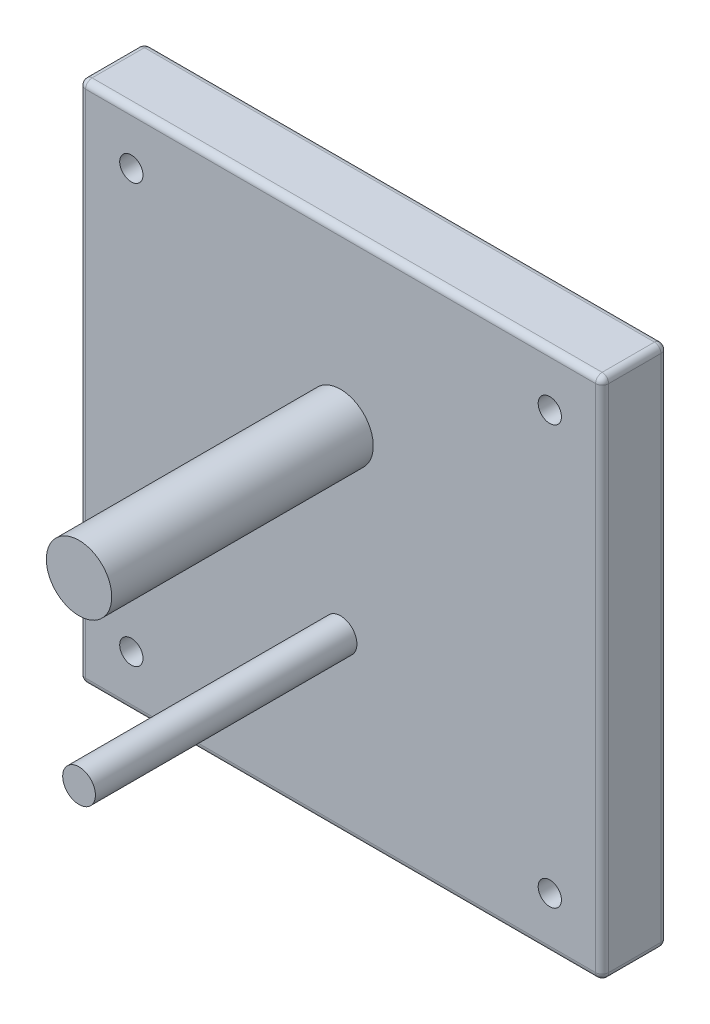
ISO-10303-21;
HEADER;
FILE_DESCRIPTION(('STEP AP214'),'2;1');
FILE_NAME('part.step','',(''),(''),'','','');
FILE_SCHEMA(('AUTOMOTIVE_DESIGN { 1 0 10303 214 1 1 1 1 }'));
ENDSEC;
DATA;
#1=APPLICATION_CONTEXT('core data for automotive mechanical design processes');
#2=APPLICATION_PROTOCOL_DEFINITION('international standard','automotive_design',2000,#1);
#3=PRODUCT_CONTEXT('',#1,'mechanical');
#4=PRODUCT('Part','Part','',(#3));
#5=PRODUCT_RELATED_PRODUCT_CATEGORY('part','',(#4));
#6=PRODUCT_DEFINITION_FORMATION('','',#4);
#7=PRODUCT_DEFINITION_CONTEXT('part definition',#1,'design');
#8=PRODUCT_DEFINITION('design','',#6,#7);
#9=PRODUCT_DEFINITION_SHAPE('','',#8);
#10=(LENGTH_UNIT() NAMED_UNIT(*) SI_UNIT(.MILLI.,.METRE.));
#11=(NAMED_UNIT(*) PLANE_ANGLE_UNIT() SI_UNIT($,.RADIAN.));
#12=(NAMED_UNIT(*) SI_UNIT($,.STERADIAN.) SOLID_ANGLE_UNIT());
#13=UNCERTAINTY_MEASURE_WITH_UNIT(LENGTH_MEASURE(1.E-05),#10,'distance_accuracy_value','');
#14=(GEOMETRIC_REPRESENTATION_CONTEXT(3) GLOBAL_UNCERTAINTY_ASSIGNED_CONTEXT((#13)) GLOBAL_UNIT_ASSIGNED_CONTEXT((#10,
#11,#12)) REPRESENTATION_CONTEXT('',''));
#15=CARTESIAN_POINT('',(0.,0.,0.));
#16=DIRECTION('',(0.,0.,1.));
#17=DIRECTION('',(1.,0.,0.));
#18=AXIS2_PLACEMENT_3D('',#15,#16,#17);
#19=CARTESIAN_POINT('',(25.4,25.4,6.35));
#20=DIRECTION('',(0.,-1.,0.));
#21=DIRECTION('',(0.,0.,-1.));
#22=AXIS2_PLACEMENT_3D('',#19,#20,#21);
#23=PLANE('',#22);
#24=DIRECTION('',(-1.,0.,0.));
#25=VECTOR('',#24,1.);
#26=CARTESIAN_POINT('',(25.4,25.4,5.715));
#27=LINE('',#26,#25);
#28=CARTESIAN_POINT('',(-24.765,25.4,5.715));
#29=VERTEX_POINT('',#28);
#30=CARTESIAN_POINT('',(24.765,25.4,5.715));
#31=VERTEX_POINT('',#30);
#32=EDGE_CURVE('E219',#29,#31,#27,.F.);
#33=ORIENTED_EDGE('',*,*,#32,.T.);
#34=DIRECTION('',(0.,0.,-1.));
#35=VECTOR('',#34,1.);
#36=CARTESIAN_POINT('',(24.765,25.4,6.35));
#37=LINE('',#36,#35);
#38=CARTESIAN_POINT('',(24.765,25.4,0.635));
#39=VERTEX_POINT('',#38);
#40=EDGE_CURVE('E222',#31,#39,#37,.T.);
#41=ORIENTED_EDGE('',*,*,#40,.T.);
#42=DIRECTION('',(-1.,0.,0.));
#43=VECTOR('',#42,1.);
#44=CARTESIAN_POINT('',(-25.4,25.4,0.635));
#45=LINE('',#44,#43);
#46=CARTESIAN_POINT('',(-24.765,25.4,0.635));
#47=VERTEX_POINT('',#46);
#48=EDGE_CURVE('E216',#39,#47,#45,.T.);
#49=ORIENTED_EDGE('',*,*,#48,.T.);
#50=DIRECTION('',(0.,0.,-1.));
#51=VECTOR('',#50,1.);
#52=CARTESIAN_POINT('',(-24.765,25.4,6.35));
#53=LINE('',#52,#51);
#54=EDGE_CURVE('E213',#47,#29,#53,.F.);
#55=ORIENTED_EDGE('',*,*,#54,.T.);
#56=EDGE_LOOP('',(#33,#41,#49,#55));
#57=FACE_BOUND('',#56,.T.);
#58=ADVANCED_FACE('F45',(#57),#23,.F.);
#59=CARTESIAN_POINT('',(-25.4,-25.4,6.35));
#60=DIRECTION('',(1.,0.,0.));
#61=DIRECTION('',(0.,0.,-1.));
#62=AXIS2_PLACEMENT_3D('',#59,#60,#61);
#63=PLANE('',#62);
#64=DIRECTION('',(0.,-1.,0.));
#65=VECTOR('',#64,1.);
#66=CARTESIAN_POINT('',(-25.4,-25.4,5.715));
#67=LINE('',#66,#65);
#68=CARTESIAN_POINT('',(-25.4,-24.765,5.715));
#69=VERTEX_POINT('',#68);
#70=CARTESIAN_POINT('',(-25.4,24.765,5.715));
#71=VERTEX_POINT('',#70);
#72=EDGE_CURVE('E153',#69,#71,#67,.F.);
#73=ORIENTED_EDGE('',*,*,#72,.T.);
#74=DIRECTION('',(0.,0.,-1.));
#75=VECTOR('',#74,1.);
#76=CARTESIAN_POINT('',(-25.4,24.765,6.35));
#77=LINE('',#76,#75);
#78=CARTESIAN_POINT('',(-25.4,24.765,0.635));
#79=VERTEX_POINT('',#78);
#80=EDGE_CURVE('E234',#71,#79,#77,.T.);
#81=ORIENTED_EDGE('',*,*,#80,.T.);
#82=DIRECTION('',(0.,-1.,0.));
#83=VECTOR('',#82,1.);
#84=CARTESIAN_POINT('',(-25.4,-25.4,0.635));
#85=LINE('',#84,#83);
#86=CARTESIAN_POINT('',(-25.4,-24.765,0.635));
#87=VERTEX_POINT('',#86);
#88=EDGE_CURVE('E229',#79,#87,#85,.T.);
#89=ORIENTED_EDGE('',*,*,#88,.T.);
#90=DIRECTION('',(0.,0.,-1.));
#91=VECTOR('',#90,1.);
#92=CARTESIAN_POINT('',(-25.4,-24.765,6.35));
#93=LINE('',#92,#91);
#94=EDGE_CURVE('E226',#87,#69,#93,.F.);
#95=ORIENTED_EDGE('',*,*,#94,.T.);
#96=EDGE_LOOP('',(#73,#81,#89,#95));
#97=FACE_BOUND('',#96,.T.);
#98=ADVANCED_FACE('F388',(#97),#63,.F.);
#99=CARTESIAN_POINT('',(25.4,-25.4,6.35));
#100=DIRECTION('',(0.,1.,0.));
#101=DIRECTION('',(0.,0.,1.));
#102=AXIS2_PLACEMENT_3D('',#99,#100,#101);
#103=PLANE('',#102);
#104=DIRECTION('',(1.,0.,0.));
#105=VECTOR('',#104,1.);
#106=CARTESIAN_POINT('',(25.4,-25.4,5.715));
#107=LINE('',#106,#105);
#108=CARTESIAN_POINT('',(24.765,-25.4,5.715));
#109=VERTEX_POINT('',#108);
#110=CARTESIAN_POINT('',(-24.765,-25.4,5.715));
#111=VERTEX_POINT('',#110);
#112=EDGE_CURVE('E55',#109,#111,#107,.F.);
#113=ORIENTED_EDGE('',*,*,#112,.T.);
#114=DIRECTION('',(0.,0.,-1.));
#115=VECTOR('',#114,1.);
#116=CARTESIAN_POINT('',(-24.765,-25.4,6.35));
#117=LINE('',#116,#115);
#118=CARTESIAN_POINT('',(-24.765,-25.4,0.635));
#119=VERTEX_POINT('',#118);
#120=EDGE_CURVE('E11',#111,#119,#117,.T.);
#121=ORIENTED_EDGE('',*,*,#120,.T.);
#122=DIRECTION('',(1.,0.,0.));
#123=VECTOR('',#122,1.);
#124=CARTESIAN_POINT('',(25.4,-25.4,0.635));
#125=LINE('',#124,#123);
#126=CARTESIAN_POINT('',(24.765,-25.4,0.635));
#127=VERTEX_POINT('',#126);
#128=EDGE_CURVE('E238',#119,#127,#125,.T.);
#129=ORIENTED_EDGE('',*,*,#128,.T.);
#130=DIRECTION('',(0.,0.,-1.));
#131=VECTOR('',#130,1.);
#132=CARTESIAN_POINT('',(24.765,-25.4,6.35));
#133=LINE('',#132,#131);
#134=EDGE_CURVE('E66',#127,#109,#133,.F.);
#135=ORIENTED_EDGE('',*,*,#134,.T.);
#136=EDGE_LOOP('',(#113,#121,#129,#135));
#137=FACE_BOUND('',#136,.T.);
#138=ADVANCED_FACE('F383',(#137),#103,.F.);
#139=CARTESIAN_POINT('',(25.4,-25.4,6.35));
#140=DIRECTION('',(-1.,0.,0.));
#141=DIRECTION('',(0.,0.,1.));
#142=AXIS2_PLACEMENT_3D('',#139,#140,#141);
#143=PLANE('',#142);
#144=DIRECTION('',(0.,1.,0.));
#145=VECTOR('',#144,1.);
#146=CARTESIAN_POINT('',(25.4,25.4,0.635));
#147=LINE('',#146,#145);
#148=CARTESIAN_POINT('',(25.4,-24.765,0.635));
#149=VERTEX_POINT('',#148);
#150=CARTESIAN_POINT('',(25.4,24.765,0.635));
#151=VERTEX_POINT('',#150);
#152=EDGE_CURVE('E190',#149,#151,#147,.T.);
#153=ORIENTED_EDGE('',*,*,#152,.T.);
#154=DIRECTION('',(0.,0.,-1.));
#155=VECTOR('',#154,1.);
#156=CARTESIAN_POINT('',(25.4,24.765,6.35));
#157=LINE('',#156,#155);
#158=CARTESIAN_POINT('',(25.4,24.765,5.715));
#159=VERTEX_POINT('',#158);
#160=EDGE_CURVE('E197',#151,#159,#157,.F.);
#161=ORIENTED_EDGE('',*,*,#160,.T.);
#162=DIRECTION('',(0.,1.,0.));
#163=VECTOR('',#162,1.);
#164=CARTESIAN_POINT('',(25.4,-25.4,5.715));
#165=LINE('',#164,#163);
#166=CARTESIAN_POINT('',(25.4,-24.765,5.715));
#167=VERTEX_POINT('',#166);
#168=EDGE_CURVE('E193',#159,#167,#165,.F.);
#169=ORIENTED_EDGE('',*,*,#168,.T.);
#170=DIRECTION('',(0.,0.,-1.));
#171=VECTOR('',#170,1.);
#172=CARTESIAN_POINT('',(25.4,-24.765,6.35));
#173=LINE('',#172,#171);
#174=EDGE_CURVE('E187',#167,#149,#173,.T.);
#175=ORIENTED_EDGE('',*,*,#174,.T.);
#176=EDGE_LOOP('',(#153,#161,#169,#175));
#177=FACE_BOUND('',#176,.T.);
#178=ADVANCED_FACE('F375',(#177),#143,.F.);
#179=CARTESIAN_POINT('',(0.,0.,6.35));
#180=DIRECTION('',(0.,0.,-1.));
#181=DIRECTION('',(-1.,0.,0.));
#182=AXIS2_PLACEMENT_3D('',#179,#180,#181);
#183=PLANE('',#182);
#184=DIRECTION('',(1.,0.,0.));
#185=VECTOR('',#184,1.);
#186=CARTESIAN_POINT('',(0.,-24.765,6.35));
#187=LINE('',#186,#185);
#188=CARTESIAN_POINT('',(-24.765,-24.765,6.35));
#189=VERTEX_POINT('',#188);
#190=CARTESIAN_POINT('',(24.765,-24.765,6.35));
#191=VERTEX_POINT('',#190);
#192=EDGE_CURVE('E139',#189,#191,#187,.T.);
#193=ORIENTED_EDGE('',*,*,#192,.T.);
#194=DIRECTION('',(0.,1.,0.));
#195=VECTOR('',#194,1.);
#196=CARTESIAN_POINT('',(24.765,0.,6.35));
#197=LINE('',#196,#195);
#198=CARTESIAN_POINT('',(24.765,24.765,6.35));
#199=VERTEX_POINT('',#198);
#200=EDGE_CURVE('E184',#191,#199,#197,.T.);
#201=ORIENTED_EDGE('',*,*,#200,.T.);
#202=DIRECTION('',(-1.,0.,0.));
#203=VECTOR('',#202,1.);
#204=CARTESIAN_POINT('',(0.,24.765,6.35));
#205=LINE('',#204,#203);
#206=CARTESIAN_POINT('',(-24.765,24.765,6.35));
#207=VERTEX_POINT('',#206);
#208=EDGE_CURVE('E142',#199,#207,#205,.T.);
#209=ORIENTED_EDGE('',*,*,#208,.T.);
#210=DIRECTION('',(0.,-1.,0.));
#211=VECTOR('',#210,1.);
#212=CARTESIAN_POINT('',(-24.765,0.,6.35));
#213=LINE('',#212,#211);
#214=EDGE_CURVE('E133',#207,#189,#213,.T.);
#215=ORIENTED_EDGE('',*,*,#214,.T.);
#216=EDGE_LOOP('',(#193,#201,#209,#215));
#217=FACE_BOUND('',#216,.T.);
#218=CARTESIAN_POINT('',(-20.32,20.32,6.35));
#219=DIRECTION('',(0.,0.,1.));
#220=DIRECTION('',(1.,0.,0.));
#221=AXIS2_PLACEMENT_3D('',#218,#219,#220);
#222=CIRCLE('',#221,1.1303);
#223=CARTESIAN_POINT('',(-19.1897,20.32,6.35));
#224=VERTEX_POINT('',#223);
#225=EDGE_CURVE('E321',#224,#224,#222,.T.);
#226=ORIENTED_EDGE('',*,*,#225,.F.);
#227=EDGE_LOOP('',(#226));
#228=FACE_BOUND('',#227,.T.);
#229=CARTESIAN_POINT('',(20.32,20.32,6.35));
#230=DIRECTION('',(0.,0.,1.));
#231=DIRECTION('',(1.,0.,0.));
#232=AXIS2_PLACEMENT_3D('',#229,#230,#231);
#233=CIRCLE('',#232,1.1303);
#234=CARTESIAN_POINT('',(21.4503,20.32,6.35));
#235=VERTEX_POINT('',#234);
#236=EDGE_CURVE('E334',#235,#235,#233,.T.);
#237=ORIENTED_EDGE('',*,*,#236,.F.);
#238=EDGE_LOOP('',(#237));
#239=FACE_BOUND('',#238,.T.);
#240=CARTESIAN_POINT('',(20.32,-20.32,6.35));
#241=DIRECTION('',(0.,0.,1.));
#242=DIRECTION('',(1.,0.,0.));
#243=AXIS2_PLACEMENT_3D('',#240,#241,#242);
#244=CIRCLE('',#243,1.1303);
#245=CARTESIAN_POINT('',(21.4503,-20.32,6.35));
#246=VERTEX_POINT('',#245);
#247=EDGE_CURVE('E344',#246,#246,#244,.T.);
#248=ORIENTED_EDGE('',*,*,#247,.F.);
#249=EDGE_LOOP('',(#248));
#250=FACE_BOUND('',#249,.T.);
#251=CARTESIAN_POINT('',(-20.32,-20.32,6.35));
#252=DIRECTION('',(0.,0.,1.));
#253=DIRECTION('',(1.,0.,0.));
#254=AXIS2_PLACEMENT_3D('',#251,#252,#253);
#255=CIRCLE('',#254,1.1303);
#256=CARTESIAN_POINT('',(-19.1897,-20.32,6.35));
#257=VERTEX_POINT('',#256);
#258=EDGE_CURVE('E352',#257,#257,#255,.T.);
#259=ORIENTED_EDGE('',*,*,#258,.F.);
#260=EDGE_LOOP('',(#259));
#261=FACE_BOUND('',#260,.T.);
#262=CARTESIAN_POINT('',(0.,-8.73125,6.35));
#263=DIRECTION('',(0.,0.,-1.));
#264=DIRECTION('',(-1.,0.,0.));
#265=AXIS2_PLACEMENT_3D('',#262,#263,#264);
#266=CIRCLE('',#265,1.5875);
#267=CARTESIAN_POINT('',(-1.5875,-8.73125,6.35));
#268=VERTEX_POINT('',#267);
#269=EDGE_CURVE('E174',#268,#268,#266,.F.);
#270=ORIENTED_EDGE('',*,*,#269,.F.);
#271=EDGE_LOOP('',(#270));
#272=FACE_BOUND('',#271,.T.);
#273=CARTESIAN_POINT('',(0.,8.73125,6.35));
#274=DIRECTION('',(0.,0.,-1.));
#275=DIRECTION('',(-1.,0.,0.));
#276=AXIS2_PLACEMENT_3D('',#273,#274,#275);
#277=CIRCLE('',#276,3.175);
#278=CARTESIAN_POINT('',(-3.175,8.73125,6.35));
#279=VERTEX_POINT('',#278);
#280=EDGE_CURVE('E178',#279,#279,#277,.F.);
#281=ORIENTED_EDGE('',*,*,#280,.F.);
#282=EDGE_LOOP('',(#281));
#283=FACE_BOUND('',#282,.T.);
#284=ADVANCED_FACE('F135',(#217,#228,#239,#250,#261,#272,#283),#183,.F.);
#285=CARTESIAN_POINT('',(0.,0.,0.));
#286=DIRECTION('',(0.,0.,-1.));
#287=DIRECTION('',(-1.,0.,0.));
#288=AXIS2_PLACEMENT_3D('',#285,#286,#287);
#289=PLANE('',#288);
#290=DIRECTION('',(-1.,0.,0.));
#291=VECTOR('',#290,1.);
#292=CARTESIAN_POINT('',(25.4,24.765,0.));
#293=LINE('',#292,#291);
#294=CARTESIAN_POINT('',(-24.765,24.765,0.));
#295=VERTEX_POINT('',#294);
#296=CARTESIAN_POINT('',(24.765,24.765,0.));
#297=VERTEX_POINT('',#296);
#298=EDGE_CURVE('E206',#295,#297,#293,.F.);
#299=ORIENTED_EDGE('',*,*,#298,.T.);
#300=DIRECTION('',(0.,1.,0.));
#301=VECTOR('',#300,1.);
#302=CARTESIAN_POINT('',(24.765,-25.4,0.));
#303=LINE('',#302,#301);
#304=CARTESIAN_POINT('',(24.765,-24.765,0.));
#305=VERTEX_POINT('',#304);
#306=EDGE_CURVE('E209',#297,#305,#303,.F.);
#307=ORIENTED_EDGE('',*,*,#306,.T.);
#308=DIRECTION('',(1.,0.,0.));
#309=VECTOR('',#308,1.);
#310=CARTESIAN_POINT('',(-25.4,-24.765,0.));
#311=LINE('',#310,#309);
#312=CARTESIAN_POINT('',(-24.765,-24.765,0.));
#313=VERTEX_POINT('',#312);
#314=EDGE_CURVE('E200',#305,#313,#311,.F.);
#315=ORIENTED_EDGE('',*,*,#314,.T.);
#316=DIRECTION('',(0.,-1.,0.));
#317=VECTOR('',#316,1.);
#318=CARTESIAN_POINT('',(-24.765,25.4,0.));
#319=LINE('',#318,#317);
#320=EDGE_CURVE('E203',#313,#295,#319,.F.);
#321=ORIENTED_EDGE('',*,*,#320,.T.);
#322=EDGE_LOOP('',(#299,#307,#315,#321));
#323=FACE_BOUND('',#322,.T.);
#324=CARTESIAN_POINT('',(-20.32,20.32,0.));
#325=DIRECTION('',(0.,0.,1.));
#326=DIRECTION('',(1.,0.,0.));
#327=AXIS2_PLACEMENT_3D('',#324,#325,#326);
#328=CIRCLE('',#327,1.1303);
#329=CARTESIAN_POINT('',(-19.1897,20.32,0.));
#330=VERTEX_POINT('',#329);
#331=EDGE_CURVE('E328',#330,#330,#328,.T.);
#332=ORIENTED_EDGE('',*,*,#331,.T.);
#333=EDGE_LOOP('',(#332));
#334=FACE_BOUND('',#333,.T.);
#335=CARTESIAN_POINT('',(20.32,20.32,0.));
#336=DIRECTION('',(0.,0.,1.));
#337=DIRECTION('',(1.,0.,0.));
#338=AXIS2_PLACEMENT_3D('',#335,#336,#337);
#339=CIRCLE('',#338,1.1303);
#340=CARTESIAN_POINT('',(21.4503,20.32,0.));
#341=VERTEX_POINT('',#340);
#342=EDGE_CURVE('E340',#341,#341,#339,.T.);
#343=ORIENTED_EDGE('',*,*,#342,.T.);
#344=EDGE_LOOP('',(#343));
#345=FACE_BOUND('',#344,.T.);
#346=CARTESIAN_POINT('',(20.32,-20.32,0.));
#347=DIRECTION('',(0.,0.,1.));
#348=DIRECTION('',(1.,0.,0.));
#349=AXIS2_PLACEMENT_3D('',#346,#347,#348);
#350=CIRCLE('',#349,1.1303);
#351=CARTESIAN_POINT('',(21.4503,-20.32,0.));
#352=VERTEX_POINT('',#351);
#353=EDGE_CURVE('E348',#352,#352,#350,.T.);
#354=ORIENTED_EDGE('',*,*,#353,.T.);
#355=EDGE_LOOP('',(#354));
#356=FACE_BOUND('',#355,.T.);
#357=CARTESIAN_POINT('',(-20.32,-20.32,0.));
#358=DIRECTION('',(0.,0.,1.));
#359=DIRECTION('',(1.,0.,0.));
#360=AXIS2_PLACEMENT_3D('',#357,#358,#359);
#361=CIRCLE('',#360,1.1303);
#362=CARTESIAN_POINT('',(-19.1897,-20.32,0.));
#363=VERTEX_POINT('',#362);
#364=EDGE_CURVE('E356',#363,#363,#361,.T.);
#365=ORIENTED_EDGE('',*,*,#364,.T.);
#366=EDGE_LOOP('',(#365));
#367=FACE_BOUND('',#366,.T.);
#368=ADVANCED_FACE('F374',(#323,#334,#345,#356,#367),#289,.T.);
#369=CARTESIAN_POINT('',(0.,8.73125,31.75));
#370=DIRECTION('',(0.,0.,-1.));
#371=DIRECTION('',(-1.,0.,0.));
#372=AXIS2_PLACEMENT_3D('',#369,#370,#371);
#373=CYLINDRICAL_SURFACE('',#372,3.175);
#374=CARTESIAN_POINT('',(0.,8.73125,31.75));
#375=DIRECTION('',(0.,0.,1.));
#376=DIRECTION('',(1.,0.,0.));
#377=AXIS2_PLACEMENT_3D('',#374,#375,#376);
#378=CIRCLE('',#377,3.175);
#379=CARTESIAN_POINT('',(3.175,8.73125,31.75));
#380=VERTEX_POINT('',#379);
#381=EDGE_CURVE('E360',#380,#380,#378,.T.);
#382=ORIENTED_EDGE('',*,*,#381,.F.);
#383=EDGE_LOOP('',(#382));
#384=FACE_BOUND('',#383,.T.);
#385=ORIENTED_EDGE('',*,*,#280,.T.);
#386=EDGE_LOOP('',(#385));
#387=FACE_BOUND('',#386,.T.);
#388=ADVANCED_FACE('F371',(#384,#387),#373,.T.);
#389=CARTESIAN_POINT('',(0.,8.73125,31.75));
#390=DIRECTION('',(0.,0.,1.));
#391=DIRECTION('',(1.,0.,0.));
#392=AXIS2_PLACEMENT_3D('',#389,#390,#391);
#393=PLANE('',#392);
#394=ORIENTED_EDGE('',*,*,#381,.T.);
#395=EDGE_LOOP('',(#394));
#396=FACE_BOUND('',#395,.T.);
#397=ADVANCED_FACE('F509',(#396),#393,.T.);
#398=CARTESIAN_POINT('',(0.,-8.73125,31.75));
#399=DIRECTION('',(0.,0.,-1.));
#400=DIRECTION('',(-1.,0.,0.));
#401=AXIS2_PLACEMENT_3D('',#398,#399,#400);
#402=CYLINDRICAL_SURFACE('',#401,1.5875);
#403=CARTESIAN_POINT('',(0.,-8.73125,31.75));
#404=DIRECTION('',(0.,0.,1.));
#405=DIRECTION('',(1.,0.,0.));
#406=AXIS2_PLACEMENT_3D('',#403,#404,#405);
#407=CIRCLE('',#406,1.5875);
#408=CARTESIAN_POINT('',(1.5875,-8.73125,31.75));
#409=VERTEX_POINT('',#408);
#410=EDGE_CURVE('E361',#409,#409,#407,.T.);
#411=ORIENTED_EDGE('',*,*,#410,.F.);
#412=EDGE_LOOP('',(#411));
#413=FACE_BOUND('',#412,.T.);
#414=ORIENTED_EDGE('',*,*,#269,.T.);
#415=EDGE_LOOP('',(#414));
#416=FACE_BOUND('',#415,.T.);
#417=ADVANCED_FACE('F519',(#413,#416),#402,.T.);
#418=CARTESIAN_POINT('',(0.,-8.73125,31.75));
#419=DIRECTION('',(0.,0.,1.));
#420=DIRECTION('',(1.,0.,0.));
#421=AXIS2_PLACEMENT_3D('',#418,#419,#420);
#422=PLANE('',#421);
#423=ORIENTED_EDGE('',*,*,#410,.T.);
#424=EDGE_LOOP('',(#423));
#425=FACE_BOUND('',#424,.T.);
#426=ADVANCED_FACE('F528',(#425),#422,.T.);
#427=CARTESIAN_POINT('',(-20.32,-20.32,6.35));
#428=DIRECTION('',(0.,0.,1.));
#429=DIRECTION('',(1.,0.,0.));
#430=AXIS2_PLACEMENT_3D('',#427,#428,#429);
#431=CYLINDRICAL_SURFACE('',#430,1.1303);
#432=ORIENTED_EDGE('',*,*,#364,.F.);
#433=EDGE_LOOP('',(#432));
#434=FACE_BOUND('',#433,.T.);
#435=ORIENTED_EDGE('',*,*,#258,.T.);
#436=EDGE_LOOP('',(#435));
#437=FACE_BOUND('',#436,.T.);
#438=ADVANCED_FACE('F538',(#434,#437),#431,.F.);
#439=CARTESIAN_POINT('',(20.32,-20.32,6.35));
#440=DIRECTION('',(0.,0.,1.));
#441=DIRECTION('',(1.,0.,0.));
#442=AXIS2_PLACEMENT_3D('',#439,#440,#441);
#443=CYLINDRICAL_SURFACE('',#442,1.1303);
#444=ORIENTED_EDGE('',*,*,#353,.F.);
#445=EDGE_LOOP('',(#444));
#446=FACE_BOUND('',#445,.T.);
#447=ORIENTED_EDGE('',*,*,#247,.T.);
#448=EDGE_LOOP('',(#447));
#449=FACE_BOUND('',#448,.T.);
#450=ADVANCED_FACE('F548',(#446,#449),#443,.F.);
#451=CARTESIAN_POINT('',(20.32,20.32,6.35));
#452=DIRECTION('',(0.,0.,1.));
#453=DIRECTION('',(1.,0.,0.));
#454=AXIS2_PLACEMENT_3D('',#451,#452,#453);
#455=CYLINDRICAL_SURFACE('',#454,1.1303);
#456=ORIENTED_EDGE('',*,*,#342,.F.);
#457=EDGE_LOOP('',(#456));
#458=FACE_BOUND('',#457,.T.);
#459=ORIENTED_EDGE('',*,*,#236,.T.);
#460=EDGE_LOOP('',(#459));
#461=FACE_BOUND('',#460,.T.);
#462=ADVANCED_FACE('F558',(#458,#461),#455,.F.);
#463=CARTESIAN_POINT('',(-20.32,20.32,6.35));
#464=DIRECTION('',(0.,0.,1.));
#465=DIRECTION('',(1.,0.,0.));
#466=AXIS2_PLACEMENT_3D('',#463,#464,#465);
#467=CYLINDRICAL_SURFACE('',#466,1.1303);
#468=ORIENTED_EDGE('',*,*,#331,.F.);
#469=EDGE_LOOP('',(#468));
#470=FACE_BOUND('',#469,.T.);
#471=ORIENTED_EDGE('',*,*,#225,.T.);
#472=EDGE_LOOP('',(#471));
#473=FACE_BOUND('',#472,.T.);
#474=ADVANCED_FACE('F468',(#470,#473),#467,.F.);
#475=CARTESIAN_POINT('',(-24.765,-25.4,0.635));
#476=DIRECTION('',(0.,1.,0.));
#477=DIRECTION('',(0.,0.,1.));
#478=AXIS2_PLACEMENT_3D('',#475,#476,#477);
#479=CYLINDRICAL_SURFACE('',#478,0.635);
#480=CARTESIAN_POINT('',(-24.765,-24.765,0.635));
#481=DIRECTION('',(0.,-1.,0.));
#482=DIRECTION('',(0.,0.,-1.));
#483=AXIS2_PLACEMENT_3D('',#480,#481,#482);
#484=CIRCLE('',#483,0.635);
#485=EDGE_CURVE('E49',#87,#313,#484,.T.);
#486=ORIENTED_EDGE('',*,*,#485,.F.);
#487=ORIENTED_EDGE('',*,*,#88,.F.);
#488=CARTESIAN_POINT('',(-24.765,24.765,0.635));
#489=DIRECTION('',(0.,1.,0.));
#490=DIRECTION('',(-1.,0.,0.));
#491=AXIS2_PLACEMENT_3D('',#488,#489,#490);
#492=CIRCLE('',#491,0.635);
#493=EDGE_CURVE('E311',#295,#79,#492,.T.);
#494=ORIENTED_EDGE('',*,*,#493,.F.);
#495=ORIENTED_EDGE('',*,*,#320,.F.);
#496=EDGE_LOOP('',(#486,#487,#494,#495));
#497=FACE_BOUND('',#496,.T.);
#498=ADVANCED_FACE('F47',(#497),#479,.T.);
#499=CARTESIAN_POINT('',(-24.765,-24.765,0.635));
#500=DIRECTION('',(0.,0.,-1.));
#501=DIRECTION('',(-1.,0.,0.));
#502=AXIS2_PLACEMENT_3D('',#499,#500,#501);
#503=SPHERICAL_SURFACE('',#502,0.635);
#504=CARTESIAN_POINT('',(-24.765,-24.765,0.635));
#505=DIRECTION('',(0.,0.,-1.));
#506=DIRECTION('',(-1.,0.,0.));
#507=AXIS2_PLACEMENT_3D('',#504,#505,#506);
#508=CIRCLE('',#507,0.635);
#509=EDGE_CURVE('E304',#87,#119,#508,.F.);
#510=ORIENTED_EDGE('',*,*,#509,.F.);
#511=ORIENTED_EDGE('',*,*,#485,.T.);
#512=CARTESIAN_POINT('',(-24.765,-24.765,0.635));
#513=DIRECTION('',(-1.,0.,0.));
#514=DIRECTION('',(0.,-1.,0.));
#515=AXIS2_PLACEMENT_3D('',#512,#513,#514);
#516=CIRCLE('',#515,0.635);
#517=EDGE_CURVE('E308',#119,#313,#516,.F.);
#518=ORIENTED_EDGE('',*,*,#517,.F.);
#519=EDGE_LOOP('',(#510,#511,#518));
#520=FACE_BOUND('',#519,.T.);
#521=ADVANCED_FACE('F463',(#520),#503,.T.);
#522=CARTESIAN_POINT('',(-24.765,24.765,0.635));
#523=DIRECTION('',(-1.,0.,0.));
#524=DIRECTION('',(0.,-1.,0.));
#525=AXIS2_PLACEMENT_3D('',#522,#523,#524);
#526=SPHERICAL_SURFACE('',#525,0.635);
#527=CARTESIAN_POINT('',(-24.765,24.765,0.635));
#528=DIRECTION('',(-1.,0.,0.));
#529=DIRECTION('',(0.,0.,1.));
#530=AXIS2_PLACEMENT_3D('',#527,#528,#529);
#531=CIRCLE('',#530,0.635);
#532=EDGE_CURVE('E297',#295,#47,#531,.F.);
#533=ORIENTED_EDGE('',*,*,#532,.F.);
#534=ORIENTED_EDGE('',*,*,#493,.T.);
#535=CARTESIAN_POINT('',(-24.765,24.765,0.635));
#536=DIRECTION('',(0.,0.,-1.));
#537=DIRECTION('',(-1.,0.,0.));
#538=AXIS2_PLACEMENT_3D('',#535,#536,#537);
#539=CIRCLE('',#538,0.635);
#540=EDGE_CURVE('E301',#47,#79,#539,.F.);
#541=ORIENTED_EDGE('',*,*,#540,.F.);
#542=EDGE_LOOP('',(#533,#534,#541));
#543=FACE_BOUND('',#542,.T.);
#544=ADVANCED_FACE('F460',(#543),#526,.T.);
#545=CARTESIAN_POINT('',(25.4,-24.765,0.635));
#546=DIRECTION('',(-1.,0.,0.));
#547=DIRECTION('',(0.,0.,1.));
#548=AXIS2_PLACEMENT_3D('',#545,#546,#547);
#549=CYLINDRICAL_SURFACE('',#548,0.635);
#550=ORIENTED_EDGE('',*,*,#517,.T.);
#551=ORIENTED_EDGE('',*,*,#314,.F.);
#552=CARTESIAN_POINT('',(24.765,-24.765,0.635));
#553=DIRECTION('',(1.,0.,0.));
#554=DIRECTION('',(0.,0.,-1.));
#555=AXIS2_PLACEMENT_3D('',#552,#553,#554);
#556=CIRCLE('',#555,0.635);
#557=EDGE_CURVE('E290',#127,#305,#556,.T.);
#558=ORIENTED_EDGE('',*,*,#557,.F.);
#559=ORIENTED_EDGE('',*,*,#128,.F.);
#560=EDGE_LOOP('',(#550,#551,#558,#559));
#561=FACE_BOUND('',#560,.T.);
#562=ADVANCED_FACE('F456',(#561),#549,.T.);
#563=CARTESIAN_POINT('',(-24.765,-24.765,6.35));
#564=DIRECTION('',(0.,0.,-1.));
#565=DIRECTION('',(-1.,0.,0.));
#566=AXIS2_PLACEMENT_3D('',#563,#564,#565);
#567=CYLINDRICAL_SURFACE('',#566,0.635);
#568=ORIENTED_EDGE('',*,*,#509,.T.);
#569=ORIENTED_EDGE('',*,*,#120,.F.);
#570=CARTESIAN_POINT('',(-24.765,-24.765,5.715));
#571=DIRECTION('',(0.,0.,1.));
#572=DIRECTION('',(1.,0.,0.));
#573=AXIS2_PLACEMENT_3D('',#570,#571,#572);
#574=CIRCLE('',#573,0.635);
#575=EDGE_CURVE('E158',#69,#111,#574,.T.);
#576=ORIENTED_EDGE('',*,*,#575,.F.);
#577=ORIENTED_EDGE('',*,*,#94,.F.);
#578=EDGE_LOOP('',(#568,#569,#576,#577));
#579=FACE_BOUND('',#578,.T.);
#580=ADVANCED_FACE('F453',(#579),#567,.T.);
#581=CARTESIAN_POINT('',(-24.765,0.,5.715));
#582=DIRECTION('',(0.,-1.,0.));
#583=DIRECTION('',(0.,0.,-1.));
#584=AXIS2_PLACEMENT_3D('',#581,#582,#583);
#585=CYLINDRICAL_SURFACE('',#584,0.635);
#586=CARTESIAN_POINT('',(-24.765,24.765,5.715));
#587=DIRECTION('',(0.,1.,0.));
#588=DIRECTION('',(0.,0.,1.));
#589=AXIS2_PLACEMENT_3D('',#586,#587,#588);
#590=CIRCLE('',#589,0.635);
#591=EDGE_CURVE('E159',#71,#207,#590,.T.);
#592=ORIENTED_EDGE('',*,*,#591,.F.);
#593=ORIENTED_EDGE('',*,*,#72,.F.);
#594=CARTESIAN_POINT('',(-24.765,-24.765,5.715));
#595=DIRECTION('',(0.,-1.,0.));
#596=DIRECTION('',(0.,0.,-1.));
#597=AXIS2_PLACEMENT_3D('',#594,#595,#596);
#598=CIRCLE('',#597,0.635);
#599=EDGE_CURVE('E150',#189,#69,#598,.T.);
#600=ORIENTED_EDGE('',*,*,#599,.F.);
#601=ORIENTED_EDGE('',*,*,#214,.F.);
#602=EDGE_LOOP('',(#592,#593,#600,#601));
#603=FACE_BOUND('',#602,.T.);
#604=ADVANCED_FACE('F152',(#603),#585,.T.);
#605=CARTESIAN_POINT('',(-24.765,24.765,6.35));
#606=DIRECTION('',(0.,0.,-1.));
#607=DIRECTION('',(-1.,0.,0.));
#608=AXIS2_PLACEMENT_3D('',#605,#606,#607);
#609=CYLINDRICAL_SURFACE('',#608,0.635);
#610=ORIENTED_EDGE('',*,*,#540,.T.);
#611=ORIENTED_EDGE('',*,*,#80,.F.);
#612=CARTESIAN_POINT('',(-24.765,24.765,5.715));
#613=DIRECTION('',(0.,0.,1.));
#614=DIRECTION('',(1.,0.,0.));
#615=AXIS2_PLACEMENT_3D('',#612,#613,#614);
#616=CIRCLE('',#615,0.635);
#617=EDGE_CURVE('E282',#29,#71,#616,.T.);
#618=ORIENTED_EDGE('',*,*,#617,.F.);
#619=ORIENTED_EDGE('',*,*,#54,.F.);
#620=EDGE_LOOP('',(#610,#611,#618,#619));
#621=FACE_BOUND('',#620,.T.);
#622=ADVANCED_FACE('F446',(#621),#609,.T.);
#623=CARTESIAN_POINT('',(25.4,24.765,0.635));
#624=DIRECTION('',(1.,0.,0.));
#625=DIRECTION('',(0.,0.,-1.));
#626=AXIS2_PLACEMENT_3D('',#623,#624,#625);
#627=CYLINDRICAL_SURFACE('',#626,0.635);
#628=ORIENTED_EDGE('',*,*,#532,.T.);
#629=ORIENTED_EDGE('',*,*,#48,.F.);
#630=CARTESIAN_POINT('',(24.765,24.765,0.635));
#631=DIRECTION('',(1.,0.,0.));
#632=DIRECTION('',(0.,0.,-1.));
#633=AXIS2_PLACEMENT_3D('',#630,#631,#632);
#634=CIRCLE('',#633,0.635);
#635=EDGE_CURVE('E278',#297,#39,#634,.T.);
#636=ORIENTED_EDGE('',*,*,#635,.F.);
#637=ORIENTED_EDGE('',*,*,#298,.F.);
#638=EDGE_LOOP('',(#628,#629,#636,#637));
#639=FACE_BOUND('',#638,.T.);
#640=ADVANCED_FACE('F442',(#639),#627,.T.);
#641=CARTESIAN_POINT('',(24.765,-25.4,0.635));
#642=DIRECTION('',(0.,-1.,0.));
#643=DIRECTION('',(0.,0.,-1.));
#644=AXIS2_PLACEMENT_3D('',#641,#642,#643);
#645=CYLINDRICAL_SURFACE('',#644,0.635);
#646=CARTESIAN_POINT('',(24.765,-24.765,0.635));
#647=DIRECTION('',(0.,-1.,0.));
#648=DIRECTION('',(0.,0.,-1.));
#649=AXIS2_PLACEMENT_3D('',#646,#647,#648);
#650=CIRCLE('',#649,0.635);
#651=EDGE_CURVE('E293',#305,#149,#650,.T.);
#652=ORIENTED_EDGE('',*,*,#651,.F.);
#653=ORIENTED_EDGE('',*,*,#306,.F.);
#654=CARTESIAN_POINT('',(24.765,24.765,0.635));
#655=DIRECTION('',(0.,1.,0.));
#656=DIRECTION('',(0.,0.,1.));
#657=AXIS2_PLACEMENT_3D('',#654,#655,#656);
#658=CIRCLE('',#657,0.635);
#659=EDGE_CURVE('E274',#151,#297,#658,.T.);
#660=ORIENTED_EDGE('',*,*,#659,.F.);
#661=ORIENTED_EDGE('',*,*,#152,.F.);
#662=EDGE_LOOP('',(#652,#653,#660,#661));
#663=FACE_BOUND('',#662,.T.);
#664=ADVANCED_FACE('F438',(#663),#645,.T.);
#665=CARTESIAN_POINT('',(24.765,-24.765,0.635));
#666=DIRECTION('',(0.,0.,-1.));
#667=DIRECTION('',(-1.,0.,0.));
#668=AXIS2_PLACEMENT_3D('',#665,#666,#667);
#669=SPHERICAL_SURFACE('',#668,0.635);
#670=ORIENTED_EDGE('',*,*,#557,.T.);
#671=ORIENTED_EDGE('',*,*,#651,.T.);
#672=CARTESIAN_POINT('',(24.765,-24.765,0.635));
#673=DIRECTION('',(0.,0.,-1.));
#674=DIRECTION('',(-1.,0.,0.));
#675=AXIS2_PLACEMENT_3D('',#672,#673,#674);
#676=CIRCLE('',#675,0.635);
#677=EDGE_CURVE('E166',#127,#149,#676,.F.);
#678=ORIENTED_EDGE('',*,*,#677,.F.);
#679=EDGE_LOOP('',(#670,#671,#678));
#680=FACE_BOUND('',#679,.T.);
#681=ADVANCED_FACE('F435',(#680),#669,.T.);
#682=CARTESIAN_POINT('',(-24.765,-24.765,5.715));
#683=DIRECTION('',(-1.,0.,0.));
#684=DIRECTION('',(0.,0.,1.));
#685=AXIS2_PLACEMENT_3D('',#682,#683,#684);
#686=SPHERICAL_SURFACE('',#685,0.635);
#687=ORIENTED_EDGE('',*,*,#599,.T.);
#688=ORIENTED_EDGE('',*,*,#575,.T.);
#689=CARTESIAN_POINT('',(-24.765,-24.765,5.715));
#690=DIRECTION('',(-1.,0.,0.));
#691=DIRECTION('',(0.,0.,1.));
#692=AXIS2_PLACEMENT_3D('',#689,#690,#691);
#693=CIRCLE('',#692,0.635);
#694=EDGE_CURVE('E162',#189,#111,#693,.F.);
#695=ORIENTED_EDGE('',*,*,#694,.F.);
#696=EDGE_LOOP('',(#687,#688,#695));
#697=FACE_BOUND('',#696,.T.);
#698=ADVANCED_FACE('F163',(#697),#686,.T.);
#699=CARTESIAN_POINT('',(-24.765,24.765,5.715));
#700=DIRECTION('',(-1.,0.,0.));
#701=DIRECTION('',(0.,-1.,0.));
#702=AXIS2_PLACEMENT_3D('',#699,#700,#701);
#703=SPHERICAL_SURFACE('',#702,0.635);
#704=ORIENTED_EDGE('',*,*,#617,.T.);
#705=ORIENTED_EDGE('',*,*,#591,.T.);
#706=CARTESIAN_POINT('',(-24.765,24.765,5.715));
#707=DIRECTION('',(-1.,0.,0.));
#708=DIRECTION('',(0.,0.,1.));
#709=AXIS2_PLACEMENT_3D('',#706,#707,#708);
#710=CIRCLE('',#709,0.635);
#711=EDGE_CURVE('E167',#29,#207,#710,.F.);
#712=ORIENTED_EDGE('',*,*,#711,.F.);
#713=EDGE_LOOP('',(#704,#705,#712));
#714=FACE_BOUND('',#713,.T.);
#715=ADVANCED_FACE('F428',(#714),#703,.T.);
#716=CARTESIAN_POINT('',(24.765,24.765,0.635));
#717=DIRECTION('',(0.,0.,-1.));
#718=DIRECTION('',(-1.,0.,0.));
#719=AXIS2_PLACEMENT_3D('',#716,#717,#718);
#720=SPHERICAL_SURFACE('',#719,0.635);
#721=ORIENTED_EDGE('',*,*,#659,.T.);
#722=ORIENTED_EDGE('',*,*,#635,.T.);
#723=CARTESIAN_POINT('',(24.765,24.765,0.635));
#724=DIRECTION('',(0.,0.,-1.));
#725=DIRECTION('',(-1.,0.,0.));
#726=AXIS2_PLACEMENT_3D('',#723,#724,#725);
#727=CIRCLE('',#726,0.635);
#728=EDGE_CURVE('E265',#151,#39,#727,.F.);
#729=ORIENTED_EDGE('',*,*,#728,.F.);
#730=EDGE_LOOP('',(#721,#722,#729));
#731=FACE_BOUND('',#730,.T.);
#732=ADVANCED_FACE('F424',(#731),#720,.T.);
#733=CARTESIAN_POINT('',(24.765,-24.765,6.35));
#734=DIRECTION('',(0.,0.,-1.));
#735=DIRECTION('',(-1.,0.,0.));
#736=AXIS2_PLACEMENT_3D('',#733,#734,#735);
#737=CYLINDRICAL_SURFACE('',#736,0.635);
#738=ORIENTED_EDGE('',*,*,#677,.T.);
#739=ORIENTED_EDGE('',*,*,#174,.F.);
#740=CARTESIAN_POINT('',(24.765,-24.765,5.715));
#741=DIRECTION('',(0.,0.,1.));
#742=DIRECTION('',(1.,0.,0.));
#743=AXIS2_PLACEMENT_3D('',#740,#741,#742);
#744=CIRCLE('',#743,0.635);
#745=EDGE_CURVE('E261',#109,#167,#744,.T.);
#746=ORIENTED_EDGE('',*,*,#745,.F.);
#747=ORIENTED_EDGE('',*,*,#134,.F.);
#748=EDGE_LOOP('',(#738,#739,#746,#747));
#749=FACE_BOUND('',#748,.T.);
#750=ADVANCED_FACE('F421',(#749),#737,.T.);
#751=CARTESIAN_POINT('',(0.,-24.765,5.715));
#752=DIRECTION('',(1.,0.,0.));
#753=DIRECTION('',(0.,0.,-1.));
#754=AXIS2_PLACEMENT_3D('',#751,#752,#753);
#755=CYLINDRICAL_SURFACE('',#754,0.635);
#756=ORIENTED_EDGE('',*,*,#694,.T.);
#757=ORIENTED_EDGE('',*,*,#112,.F.);
#758=CARTESIAN_POINT('',(24.765,-24.765,5.715));
#759=DIRECTION('',(1.,0.,0.));
#760=DIRECTION('',(0.,0.,-1.));
#761=AXIS2_PLACEMENT_3D('',#758,#759,#760);
#762=CIRCLE('',#761,0.635);
#763=EDGE_CURVE('E171',#191,#109,#762,.T.);
#764=ORIENTED_EDGE('',*,*,#763,.F.);
#765=ORIENTED_EDGE('',*,*,#192,.F.);
#766=EDGE_LOOP('',(#756,#757,#764,#765));
#767=FACE_BOUND('',#766,.T.);
#768=ADVANCED_FACE('F169',(#767),#755,.T.);
#769=CARTESIAN_POINT('',(0.,24.765,5.715));
#770=DIRECTION('',(-1.,0.,0.));
#771=DIRECTION('',(0.,0.,1.));
#772=AXIS2_PLACEMENT_3D('',#769,#770,#771);
#773=CYLINDRICAL_SURFACE('',#772,0.635);
#774=ORIENTED_EDGE('',*,*,#711,.T.);
#775=ORIENTED_EDGE('',*,*,#208,.F.);
#776=CARTESIAN_POINT('',(24.765,24.765,5.715));
#777=DIRECTION('',(1.,0.,0.));
#778=DIRECTION('',(0.,0.,-1.));
#779=AXIS2_PLACEMENT_3D('',#776,#777,#778);
#780=CIRCLE('',#779,0.635);
#781=EDGE_CURVE('E255',#31,#199,#780,.T.);
#782=ORIENTED_EDGE('',*,*,#781,.F.);
#783=ORIENTED_EDGE('',*,*,#32,.F.);
#784=EDGE_LOOP('',(#774,#775,#782,#783));
#785=FACE_BOUND('',#784,.T.);
#786=ADVANCED_FACE('F414',(#785),#773,.T.);
#787=CARTESIAN_POINT('',(24.765,24.765,6.35));
#788=DIRECTION('',(0.,0.,-1.));
#789=DIRECTION('',(-1.,0.,0.));
#790=AXIS2_PLACEMENT_3D('',#787,#788,#789);
#791=CYLINDRICAL_SURFACE('',#790,0.635);
#792=ORIENTED_EDGE('',*,*,#728,.T.);
#793=ORIENTED_EDGE('',*,*,#40,.F.);
#794=CARTESIAN_POINT('',(24.765,24.765,5.715));
#795=DIRECTION('',(0.,0.,1.));
#796=DIRECTION('',(1.,0.,0.));
#797=AXIS2_PLACEMENT_3D('',#794,#795,#796);
#798=CIRCLE('',#797,0.635);
#799=EDGE_CURVE('E251',#159,#31,#798,.T.);
#800=ORIENTED_EDGE('',*,*,#799,.F.);
#801=ORIENTED_EDGE('',*,*,#160,.F.);
#802=EDGE_LOOP('',(#792,#793,#800,#801));
#803=FACE_BOUND('',#802,.T.);
#804=ADVANCED_FACE('F410',(#803),#791,.T.);
#805=CARTESIAN_POINT('',(24.765,-24.765,5.715));
#806=DIRECTION('',(0.,-1.,0.));
#807=DIRECTION('',(0.,0.,-1.));
#808=AXIS2_PLACEMENT_3D('',#805,#806,#807);
#809=SPHERICAL_SURFACE('',#808,0.635);
#810=ORIENTED_EDGE('',*,*,#763,.T.);
#811=ORIENTED_EDGE('',*,*,#745,.T.);
#812=CARTESIAN_POINT('',(24.765,-24.765,5.715));
#813=DIRECTION('',(0.,-1.,0.));
#814=DIRECTION('',(0.,0.,-1.));
#815=AXIS2_PLACEMENT_3D('',#812,#813,#814);
#816=CIRCLE('',#815,0.635);
#817=EDGE_CURVE('E248',#191,#167,#816,.F.);
#818=ORIENTED_EDGE('',*,*,#817,.F.);
#819=EDGE_LOOP('',(#810,#811,#818));
#820=FACE_BOUND('',#819,.T.);
#821=ADVANCED_FACE('F406',(#820),#809,.T.);
#822=CARTESIAN_POINT('',(24.765,24.765,5.715));
#823=DIRECTION('',(0.,1.,0.));
#824=DIRECTION('',(0.,0.,1.));
#825=AXIS2_PLACEMENT_3D('',#822,#823,#824);
#826=SPHERICAL_SURFACE('',#825,0.635);
#827=ORIENTED_EDGE('',*,*,#799,.T.);
#828=ORIENTED_EDGE('',*,*,#781,.T.);
#829=CARTESIAN_POINT('',(24.765,24.765,5.715));
#830=DIRECTION('',(0.,1.,0.));
#831=DIRECTION('',(0.,0.,1.));
#832=AXIS2_PLACEMENT_3D('',#829,#830,#831);
#833=CIRCLE('',#832,0.635);
#834=EDGE_CURVE('E245',#159,#199,#833,.F.);
#835=ORIENTED_EDGE('',*,*,#834,.F.);
#836=EDGE_LOOP('',(#827,#828,#835));
#837=FACE_BOUND('',#836,.T.);
#838=ADVANCED_FACE('F402',(#837),#826,.T.);
#839=CARTESIAN_POINT('',(24.765,0.,5.715));
#840=DIRECTION('',(0.,1.,0.));
#841=DIRECTION('',(0.,0.,1.));
#842=AXIS2_PLACEMENT_3D('',#839,#840,#841);
#843=CYLINDRICAL_SURFACE('',#842,0.635);
#844=ORIENTED_EDGE('',*,*,#817,.T.);
#845=ORIENTED_EDGE('',*,*,#168,.F.);
#846=ORIENTED_EDGE('',*,*,#834,.T.);
#847=ORIENTED_EDGE('',*,*,#200,.F.);
#848=EDGE_LOOP('',(#844,#845,#846,#847));
#849=FACE_BOUND('',#848,.T.);
#850=ADVANCED_FACE('F399',(#849),#843,.T.);
#851=CLOSED_SHELL('',(#58,#98,#138,#178,#284,#368,#388,#397,#417,#426,#438,#450,#462,#474,#498,
#521,#544,#562,#580,#604,#622,#640,#664,#681,#698,#715,#732,#750,#768,#786,#804,#821,#838,#850));
#852=MANIFOLD_SOLID_BREP('B2',#851);
#853=ADVANCED_BREP_SHAPE_REPRESENTATION('',(#18,#852),#14);
#854=SHAPE_DEFINITION_REPRESENTATION(#9,#853);
ENDSEC;
END-ISO-10303-21;
